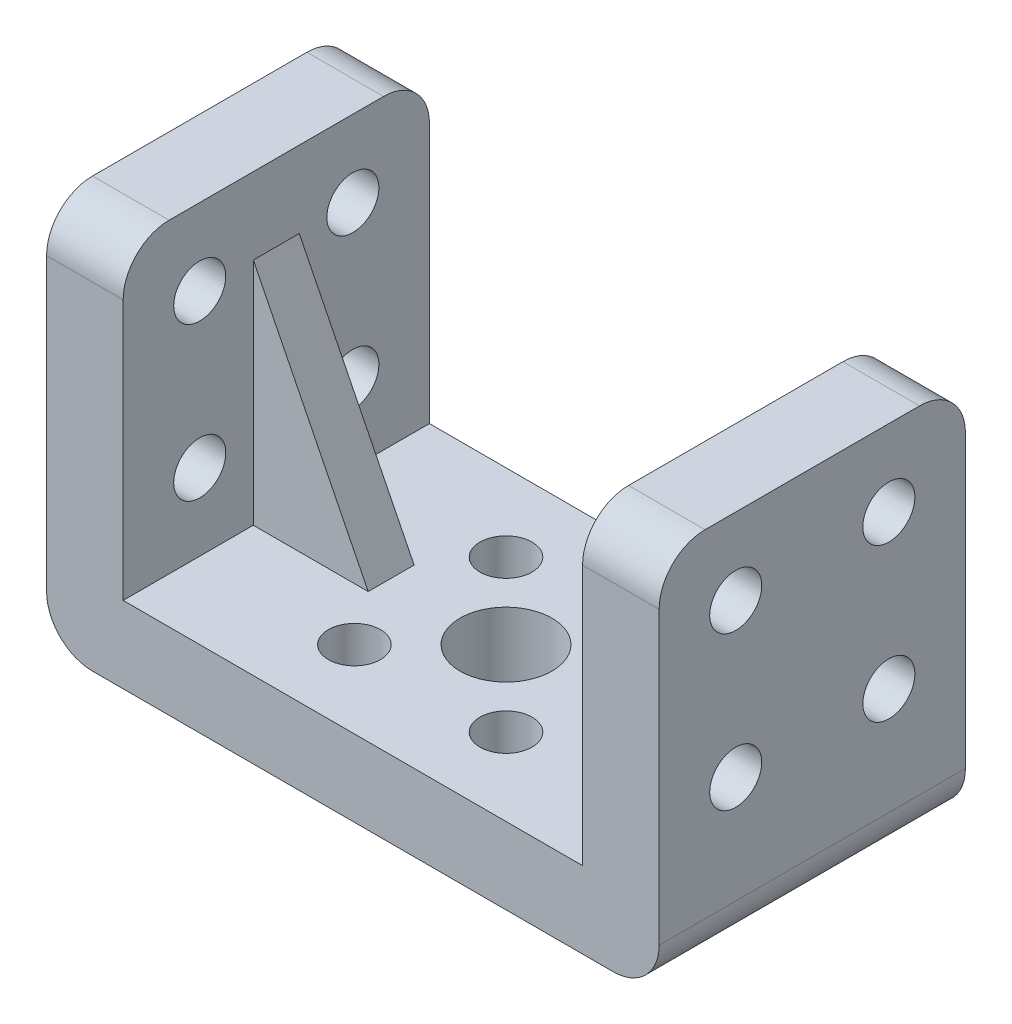
ISO-10303-21;
HEADER;
FILE_DESCRIPTION(('STEP AP214'),'2;1');
FILE_NAME('part.step','',(''),(''),'','','');
FILE_SCHEMA(('AUTOMOTIVE_DESIGN { 1 0 10303 214 1 1 1 1 }'));
ENDSEC;
DATA;
#1=APPLICATION_CONTEXT('core data for automotive mechanical design processes');
#2=APPLICATION_PROTOCOL_DEFINITION('international standard','automotive_design',2000,#1);
#3=PRODUCT_CONTEXT('',#1,'mechanical');
#4=PRODUCT('Part','Part','',(#3));
#5=PRODUCT_RELATED_PRODUCT_CATEGORY('part','',(#4));
#6=PRODUCT_DEFINITION_FORMATION('','',#4);
#7=PRODUCT_DEFINITION_CONTEXT('part definition',#1,'design');
#8=PRODUCT_DEFINITION('design','',#6,#7);
#9=PRODUCT_DEFINITION_SHAPE('','',#8);
#10=(LENGTH_UNIT() NAMED_UNIT(*) SI_UNIT(.MILLI.,.METRE.));
#11=(NAMED_UNIT(*) PLANE_ANGLE_UNIT() SI_UNIT($,.RADIAN.));
#12=(NAMED_UNIT(*) SI_UNIT($,.STERADIAN.) SOLID_ANGLE_UNIT());
#13=UNCERTAINTY_MEASURE_WITH_UNIT(LENGTH_MEASURE(1.E-05),#10,'distance_accuracy_value','');
#14=(GEOMETRIC_REPRESENTATION_CONTEXT(3) GLOBAL_UNCERTAINTY_ASSIGNED_CONTEXT((#13)) GLOBAL_UNIT_ASSIGNED_CONTEXT((#10,
#11,#12)) REPRESENTATION_CONTEXT('',''));
#15=CARTESIAN_POINT('',(0.,0.,0.));
#16=DIRECTION('',(0.,0.,1.));
#17=DIRECTION('',(1.,0.,0.));
#18=AXIS2_PLACEMENT_3D('',#15,#16,#17);
#19=CARTESIAN_POINT('',(0.,5.,0.));
#20=DIRECTION('',(0.,-1.,0.));
#21=DIRECTION('',(0.,0.,-1.));
#22=AXIS2_PLACEMENT_3D('',#19,#20,#21);
#23=PLANE('',#22);
#24=CARTESIAN_POINT('',(0.,5.,0.));
#25=DIRECTION('',(0.,1.,0.));
#26=DIRECTION('',(0.,0.,1.));
#27=AXIS2_PLACEMENT_3D('',#24,#25,#26);
#28=CIRCLE('',#27,3.);
#29=CARTESIAN_POINT('',(0.,5.,3.));
#30=VERTEX_POINT('',#29);
#31=EDGE_CURVE('E289',#30,#30,#28,.T.);
#32=ORIENTED_EDGE('',*,*,#31,.F.);
#33=EDGE_LOOP('',(#32));
#34=FACE_BOUND('',#33,.T.);
#35=CARTESIAN_POINT('',(-4.94974746830585,5.,-4.94974746830582));
#36=DIRECTION('',(0.,1.,0.));
#37=DIRECTION('',(0.,0.,1.));
#38=AXIS2_PLACEMENT_3D('',#35,#36,#37);
#39=CIRCLE('',#38,1.7);
#40=CARTESIAN_POINT('',(-4.94974746830585,5.,-3.24974746830582));
#41=VERTEX_POINT('',#40);
#42=EDGE_CURVE('E297',#41,#41,#39,.T.);
#43=ORIENTED_EDGE('',*,*,#42,.F.);
#44=EDGE_LOOP('',(#43));
#45=FACE_BOUND('',#44,.T.);
#46=CARTESIAN_POINT('',(-4.94974746830582,5.,4.94974746830584));
#47=DIRECTION('',(0.,1.,0.));
#48=DIRECTION('',(0.,0.,1.));
#49=AXIS2_PLACEMENT_3D('',#46,#47,#48);
#50=CIRCLE('',#49,1.7);
#51=CARTESIAN_POINT('',(-4.94974746830582,5.,6.64974746830584));
#52=VERTEX_POINT('',#51);
#53=EDGE_CURVE('E305',#52,#52,#50,.T.);
#54=ORIENTED_EDGE('',*,*,#53,.F.);
#55=EDGE_LOOP('',(#54));
#56=FACE_BOUND('',#55,.T.);
#57=CARTESIAN_POINT('',(4.94974746830584,5.,4.94974746830582));
#58=DIRECTION('',(0.,1.,0.));
#59=DIRECTION('',(0.,0.,1.));
#60=AXIS2_PLACEMENT_3D('',#57,#58,#59);
#61=CIRCLE('',#60,1.7);
#62=CARTESIAN_POINT('',(4.94974746830584,5.,6.64974746830582));
#63=VERTEX_POINT('',#62);
#64=EDGE_CURVE('E313',#63,#63,#61,.T.);
#65=ORIENTED_EDGE('',*,*,#64,.F.);
#66=EDGE_LOOP('',(#65));
#67=FACE_BOUND('',#66,.T.);
#68=CARTESIAN_POINT('',(4.94974746830582,5.,-4.94974746830585));
#69=DIRECTION('',(0.,1.,0.));
#70=DIRECTION('',(0.,0.,1.));
#71=AXIS2_PLACEMENT_3D('',#68,#69,#70);
#72=CIRCLE('',#71,1.7);
#73=CARTESIAN_POINT('',(4.94974746830582,5.,-3.24974746830585));
#74=VERTEX_POINT('',#73);
#75=EDGE_CURVE('E321',#74,#74,#72,.T.);
#76=ORIENTED_EDGE('',*,*,#75,.F.);
#77=EDGE_LOOP('',(#76));
#78=FACE_BOUND('',#77,.T.);
#79=DIRECTION('',(0.,0.,-1.));
#80=VECTOR('',#79,1.);
#81=CARTESIAN_POINT('',(-15.,5.,-10.));
#82=LINE('',#81,#80);
#83=CARTESIAN_POINT('',(-15.,5.,-1.5));
#84=VERTEX_POINT('',#83);
#85=CARTESIAN_POINT('',(-15.,5.,-10.));
#86=VERTEX_POINT('',#85);
#87=EDGE_CURVE('E194',#84,#86,#82,.T.);
#88=ORIENTED_EDGE('',*,*,#87,.F.);
#89=DIRECTION('',(1.,0.,0.));
#90=VECTOR('',#89,1.);
#91=CARTESIAN_POINT('',(-7.5,5.,-1.5));
#92=LINE('',#91,#90);
#93=CARTESIAN_POINT('',(-7.5,5.,-1.5));
#94=VERTEX_POINT('',#93);
#95=EDGE_CURVE('E210',#84,#94,#92,.T.);
#96=ORIENTED_EDGE('',*,*,#95,.T.);
#97=DIRECTION('',(0.,0.,1.));
#98=VECTOR('',#97,1.);
#99=CARTESIAN_POINT('',(-7.5,5.,-1.5));
#100=LINE('',#99,#98);
#101=CARTESIAN_POINT('',(-7.5,5.,1.5));
#102=VERTEX_POINT('',#101);
#103=EDGE_CURVE('E200',#94,#102,#100,.T.);
#104=ORIENTED_EDGE('',*,*,#103,.T.);
#105=DIRECTION('',(1.,0.,0.));
#106=VECTOR('',#105,1.);
#107=CARTESIAN_POINT('',(-7.5,5.,1.5));
#108=LINE('',#107,#106);
#109=CARTESIAN_POINT('',(-15.,5.,1.5));
#110=VERTEX_POINT('',#109);
#111=EDGE_CURVE('E197',#110,#102,#108,.T.);
#112=ORIENTED_EDGE('',*,*,#111,.F.);
#113=CARTESIAN_POINT('',(-15.,5.,10.));
#114=VERTEX_POINT('',#113);
#115=EDGE_CURVE('E181',#114,#110,#82,.T.);
#116=ORIENTED_EDGE('',*,*,#115,.F.);
#117=DIRECTION('',(1.,0.,0.));
#118=VECTOR('',#117,1.);
#119=CARTESIAN_POINT('',(-20.,5.,10.));
#120=LINE('',#119,#118);
#121=CARTESIAN_POINT('',(15.,5.,10.));
#122=VERTEX_POINT('',#121);
#123=EDGE_CURVE('E333',#114,#122,#120,.T.);
#124=ORIENTED_EDGE('',*,*,#123,.T.);
#125=DIRECTION('',(0.,0.,1.));
#126=VECTOR('',#125,1.);
#127=CARTESIAN_POINT('',(15.,5.,-10.));
#128=LINE('',#127,#126);
#129=CARTESIAN_POINT('',(15.,5.,1.5));
#130=VERTEX_POINT('',#129);
#131=EDGE_CURVE('E281',#130,#122,#128,.T.);
#132=ORIENTED_EDGE('',*,*,#131,.F.);
#133=DIRECTION('',(1.,0.,0.));
#134=VECTOR('',#133,1.);
#135=CARTESIAN_POINT('',(7.5,5.,1.5));
#136=LINE('',#135,#134);
#137=CARTESIAN_POINT('',(7.5,5.,1.5));
#138=VERTEX_POINT('',#137);
#139=EDGE_CURVE('E206',#138,#130,#136,.T.);
#140=ORIENTED_EDGE('',*,*,#139,.F.);
#141=DIRECTION('',(0.,0.,1.));
#142=VECTOR('',#141,1.);
#143=CARTESIAN_POINT('',(7.5,5.,-1.5));
#144=LINE('',#143,#142);
#145=CARTESIAN_POINT('',(7.5,5.,-1.5));
#146=VERTEX_POINT('',#145);
#147=EDGE_CURVE('E235',#146,#138,#144,.T.);
#148=ORIENTED_EDGE('',*,*,#147,.F.);
#149=DIRECTION('',(1.,0.,0.));
#150=VECTOR('',#149,1.);
#151=CARTESIAN_POINT('',(7.5,5.,-1.5));
#152=LINE('',#151,#150);
#153=CARTESIAN_POINT('',(15.,5.,-1.5));
#154=VERTEX_POINT('',#153);
#155=EDGE_CURVE('E246',#146,#154,#152,.T.);
#156=ORIENTED_EDGE('',*,*,#155,.T.);
#157=CARTESIAN_POINT('',(15.,5.,-10.));
#158=VERTEX_POINT('',#157);
#159=EDGE_CURVE('E277',#158,#154,#128,.T.);
#160=ORIENTED_EDGE('',*,*,#159,.F.);
#161=DIRECTION('',(-1.,0.,0.));
#162=VECTOR('',#161,1.);
#163=CARTESIAN_POINT('',(-20.,5.,-10.));
#164=LINE('',#163,#162);
#165=EDGE_CURVE('E329',#158,#86,#164,.T.);
#166=ORIENTED_EDGE('',*,*,#165,.T.);
#167=EDGE_LOOP('',(#88,#96,#104,#112,#116,#124,#132,#140,#148,#156,#160,#166));
#168=FACE_BOUND('',#167,.T.);
#169=ADVANCED_FACE('F45',(#34,#45,#56,#67,#78,#168),#23,.F.);
#170=CARTESIAN_POINT('',(15.,25.,-10.));
#171=DIRECTION('',(1.,0.,0.));
#172=DIRECTION('',(0.,0.,-1.));
#173=AXIS2_PLACEMENT_3D('',#170,#171,#172);
#174=PLANE('',#173);
#175=CARTESIAN_POINT('',(15.,10.,-5.));
#176=DIRECTION('',(1.,0.,0.));
#177=DIRECTION('',(0.,0.,-1.));
#178=AXIS2_PLACEMENT_3D('',#175,#176,#177);
#179=CIRCLE('',#178,1.7);
#180=CARTESIAN_POINT('',(15.,10.,-6.7));
#181=VERTEX_POINT('',#180);
#182=EDGE_CURVE('E238',#181,#181,#179,.T.);
#183=ORIENTED_EDGE('',*,*,#182,.T.);
#184=EDGE_LOOP('',(#183));
#185=FACE_BOUND('',#184,.T.);
#186=CARTESIAN_POINT('',(15.,10.,5.));
#187=DIRECTION('',(1.,0.,0.));
#188=DIRECTION('',(0.,0.,-1.));
#189=AXIS2_PLACEMENT_3D('',#186,#187,#188);
#190=CIRCLE('',#189,1.7);
#191=CARTESIAN_POINT('',(15.,10.,3.3));
#192=VERTEX_POINT('',#191);
#193=EDGE_CURVE('E375',#192,#192,#190,.T.);
#194=ORIENTED_EDGE('',*,*,#193,.T.);
#195=EDGE_LOOP('',(#194));
#196=FACE_BOUND('',#195,.T.);
#197=CARTESIAN_POINT('',(15.,20.,5.));
#198=DIRECTION('',(1.,0.,0.));
#199=DIRECTION('',(0.,0.,-1.));
#200=AXIS2_PLACEMENT_3D('',#197,#198,#199);
#201=CIRCLE('',#200,1.7);
#202=CARTESIAN_POINT('',(15.,20.,3.3));
#203=VERTEX_POINT('',#202);
#204=EDGE_CURVE('E370',#203,#203,#201,.T.);
#205=ORIENTED_EDGE('',*,*,#204,.T.);
#206=EDGE_LOOP('',(#205));
#207=FACE_BOUND('',#206,.T.);
#208=CARTESIAN_POINT('',(15.,20.,-5.));
#209=DIRECTION('',(1.,0.,0.));
#210=DIRECTION('',(0.,0.,-1.));
#211=AXIS2_PLACEMENT_3D('',#208,#209,#210);
#212=CIRCLE('',#211,1.7);
#213=CARTESIAN_POINT('',(15.,20.,-6.7));
#214=VERTEX_POINT('',#213);
#215=EDGE_CURVE('E364',#214,#214,#212,.T.);
#216=ORIENTED_EDGE('',*,*,#215,.T.);
#217=EDGE_LOOP('',(#216));
#218=FACE_BOUND('',#217,.T.);
#219=DIRECTION('',(0.,-1.,0.));
#220=VECTOR('',#219,1.);
#221=CARTESIAN_POINT('',(15.,25.,10.));
#222=LINE('',#221,#220);
#223=CARTESIAN_POINT('',(15.,22.,10.));
#224=VERTEX_POINT('',#223);
#225=EDGE_CURVE('E273',#224,#122,#222,.T.);
#226=ORIENTED_EDGE('',*,*,#225,.F.);
#227=CARTESIAN_POINT('',(15.,22.,7.));
#228=DIRECTION('',(1.,0.,0.));
#229=DIRECTION('',(0.,0.,-1.));
#230=AXIS2_PLACEMENT_3D('',#227,#228,#229);
#231=CIRCLE('',#230,3.);
#232=CARTESIAN_POINT('',(15.,25.,7.));
#233=VERTEX_POINT('',#232);
#234=EDGE_CURVE('E440',#224,#233,#231,.F.);
#235=ORIENTED_EDGE('',*,*,#234,.T.);
#236=DIRECTION('',(0.,0.,1.));
#237=VECTOR('',#236,1.);
#238=CARTESIAN_POINT('',(15.,25.,-10.));
#239=LINE('',#238,#237);
#240=CARTESIAN_POINT('',(15.,25.,-7.));
#241=VERTEX_POINT('',#240);
#242=EDGE_CURVE('E276',#241,#233,#239,.T.);
#243=ORIENTED_EDGE('',*,*,#242,.F.);
#244=CARTESIAN_POINT('',(15.,22.,-7.));
#245=DIRECTION('',(1.,0.,0.));
#246=DIRECTION('',(0.,0.,-1.));
#247=AXIS2_PLACEMENT_3D('',#244,#245,#246);
#248=CIRCLE('',#247,3.);
#249=CARTESIAN_POINT('',(15.,22.,-10.));
#250=VERTEX_POINT('',#249);
#251=EDGE_CURVE('E437',#241,#250,#248,.F.);
#252=ORIENTED_EDGE('',*,*,#251,.T.);
#253=DIRECTION('',(0.,-1.,0.));
#254=VECTOR('',#253,1.);
#255=CARTESIAN_POINT('',(15.,25.,-10.));
#256=LINE('',#255,#254);
#257=EDGE_CURVE('E227',#250,#158,#256,.T.);
#258=ORIENTED_EDGE('',*,*,#257,.T.);
#259=ORIENTED_EDGE('',*,*,#159,.T.);
#260=DIRECTION('',(0.,1.,0.));
#261=VECTOR('',#260,1.);
#262=CARTESIAN_POINT('',(15.,5.,-1.5));
#263=LINE('',#262,#261);
#264=CARTESIAN_POINT('',(15.,20.,-1.5));
#265=VERTEX_POINT('',#264);
#266=EDGE_CURVE('E242',#154,#265,#263,.T.);
#267=ORIENTED_EDGE('',*,*,#266,.T.);
#268=DIRECTION('',(0.,0.,1.));
#269=VECTOR('',#268,1.);
#270=CARTESIAN_POINT('',(15.,20.,-1.5));
#271=LINE('',#270,#269);
#272=CARTESIAN_POINT('',(15.,20.,1.5));
#273=VERTEX_POINT('',#272);
#274=EDGE_CURVE('E230',#265,#273,#271,.T.);
#275=ORIENTED_EDGE('',*,*,#274,.T.);
#276=DIRECTION('',(0.,1.,0.));
#277=VECTOR('',#276,1.);
#278=CARTESIAN_POINT('',(15.,5.,1.5));
#279=LINE('',#278,#277);
#280=EDGE_CURVE('E254',#130,#273,#279,.T.);
#281=ORIENTED_EDGE('',*,*,#280,.F.);
#282=ORIENTED_EDGE('',*,*,#131,.T.);
#283=EDGE_LOOP('',(#226,#235,#243,#252,#258,#259,#267,#275,#281,#282));
#284=FACE_BOUND('',#283,.T.);
#285=ADVANCED_FACE('F497',(#185,#196,#207,#218,#284),#174,.F.);
#286=CARTESIAN_POINT('',(0.,0.,0.));
#287=DIRECTION('',(0.,-1.,0.));
#288=DIRECTION('',(0.,0.,-1.));
#289=AXIS2_PLACEMENT_3D('',#286,#287,#288);
#290=PLANE('',#289);
#291=CARTESIAN_POINT('',(-4.94974746830585,0.,-4.94974746830582));
#292=DIRECTION('',(0.,1.,0.));
#293=DIRECTION('',(0.,0.,1.));
#294=AXIS2_PLACEMENT_3D('',#291,#292,#293);
#295=CIRCLE('',#294,1.7);
#296=CARTESIAN_POINT('',(-4.94974746830585,0.,-3.24974746830582));
#297=VERTEX_POINT('',#296);
#298=EDGE_CURVE('E293',#297,#297,#295,.T.);
#299=ORIENTED_EDGE('',*,*,#298,.T.);
#300=EDGE_LOOP('',(#299));
#301=FACE_BOUND('',#300,.T.);
#302=CARTESIAN_POINT('',(4.94974746830584,0.,4.94974746830582));
#303=DIRECTION('',(0.,1.,0.));
#304=DIRECTION('',(0.,0.,1.));
#305=AXIS2_PLACEMENT_3D('',#302,#303,#304);
#306=CIRCLE('',#305,1.7);
#307=CARTESIAN_POINT('',(4.94974746830584,0.,6.64974746830582));
#308=VERTEX_POINT('',#307);
#309=EDGE_CURVE('E309',#308,#308,#306,.T.);
#310=ORIENTED_EDGE('',*,*,#309,.T.);
#311=EDGE_LOOP('',(#310));
#312=FACE_BOUND('',#311,.T.);
#313=DIRECTION('',(1.,0.,0.));
#314=VECTOR('',#313,1.);
#315=CARTESIAN_POINT('',(-20.,0.,10.));
#316=LINE('',#315,#314);
#317=CARTESIAN_POINT('',(-17.,0.,10.));
#318=VERTEX_POINT('',#317);
#319=CARTESIAN_POINT('',(17.,0.,10.));
#320=VERTEX_POINT('',#319);
#321=EDGE_CURVE('E334',#318,#320,#316,.T.);
#322=ORIENTED_EDGE('',*,*,#321,.F.);
#323=DIRECTION('',(0.,0.,1.));
#324=VECTOR('',#323,1.);
#325=CARTESIAN_POINT('',(-17.,0.,-10.));
#326=LINE('',#325,#324);
#327=CARTESIAN_POINT('',(-17.,0.,-10.));
#328=VERTEX_POINT('',#327);
#329=EDGE_CURVE('E404',#318,#328,#326,.F.);
#330=ORIENTED_EDGE('',*,*,#329,.T.);
#331=DIRECTION('',(-1.,0.,0.));
#332=VECTOR('',#331,1.);
#333=CARTESIAN_POINT('',(-20.,0.,-10.));
#334=LINE('',#333,#332);
#335=CARTESIAN_POINT('',(17.,0.,-10.));
#336=VERTEX_POINT('',#335);
#337=EDGE_CURVE('E325',#336,#328,#334,.T.);
#338=ORIENTED_EDGE('',*,*,#337,.F.);
#339=DIRECTION('',(0.,0.,-1.));
#340=VECTOR('',#339,1.);
#341=CARTESIAN_POINT('',(17.,0.,10.));
#342=LINE('',#341,#340);
#343=EDGE_CURVE('E401',#336,#320,#342,.F.);
#344=ORIENTED_EDGE('',*,*,#343,.T.);
#345=EDGE_LOOP('',(#322,#330,#338,#344));
#346=FACE_BOUND('',#345,.T.);
#347=CARTESIAN_POINT('',(4.94974746830582,0.,-4.94974746830585));
#348=DIRECTION('',(0.,1.,0.));
#349=DIRECTION('',(0.,0.,1.));
#350=AXIS2_PLACEMENT_3D('',#347,#348,#349);
#351=CIRCLE('',#350,1.7);
#352=CARTESIAN_POINT('',(4.94974746830582,0.,-3.24974746830585));
#353=VERTEX_POINT('',#352);
#354=EDGE_CURVE('E317',#353,#353,#351,.T.);
#355=ORIENTED_EDGE('',*,*,#354,.T.);
#356=EDGE_LOOP('',(#355));
#357=FACE_BOUND('',#356,.T.);
#358=CARTESIAN_POINT('',(-4.94974746830582,0.,4.94974746830584));
#359=DIRECTION('',(0.,1.,0.));
#360=DIRECTION('',(0.,0.,1.));
#361=AXIS2_PLACEMENT_3D('',#358,#359,#360);
#362=CIRCLE('',#361,1.7);
#363=CARTESIAN_POINT('',(-4.94974746830582,0.,6.64974746830584));
#364=VERTEX_POINT('',#363);
#365=EDGE_CURVE('E301',#364,#364,#362,.T.);
#366=ORIENTED_EDGE('',*,*,#365,.T.);
#367=EDGE_LOOP('',(#366));
#368=FACE_BOUND('',#367,.T.);
#369=CARTESIAN_POINT('',(0.,0.,0.));
#370=DIRECTION('',(0.,1.,0.));
#371=DIRECTION('',(0.,0.,1.));
#372=AXIS2_PLACEMENT_3D('',#369,#370,#371);
#373=CIRCLE('',#372,3.);
#374=CARTESIAN_POINT('',(0.,0.,3.));
#375=VERTEX_POINT('',#374);
#376=EDGE_CURVE('E270',#375,#375,#373,.T.);
#377=ORIENTED_EDGE('',*,*,#376,.T.);
#378=EDGE_LOOP('',(#377));
#379=FACE_BOUND('',#378,.T.);
#380=ADVANCED_FACE('F475',(#301,#312,#346,#357,#368,#379),#290,.T.);
#381=CARTESIAN_POINT('',(20.,5.,10.));
#382=DIRECTION('',(-1.,0.,0.));
#383=DIRECTION('',(0.,0.,1.));
#384=AXIS2_PLACEMENT_3D('',#381,#382,#383);
#385=PLANE('',#384);
#386=CARTESIAN_POINT('',(20.,10.,-5.));
#387=DIRECTION('',(-1.,0.,0.));
#388=DIRECTION('',(0.,0.,1.));
#389=AXIS2_PLACEMENT_3D('',#386,#387,#388);
#390=CIRCLE('',#389,1.7);
#391=CARTESIAN_POINT('',(20.,10.,-3.3));
#392=VERTEX_POINT('',#391);
#393=EDGE_CURVE('E923',#392,#392,#390,.T.);
#394=ORIENTED_EDGE('',*,*,#393,.T.);
#395=EDGE_LOOP('',(#394));
#396=FACE_BOUND('',#395,.T.);
#397=CARTESIAN_POINT('',(20.,10.,5.));
#398=DIRECTION('',(-1.,0.,0.));
#399=DIRECTION('',(0.,0.,1.));
#400=AXIS2_PLACEMENT_3D('',#397,#398,#399);
#401=CIRCLE('',#400,1.7);
#402=CARTESIAN_POINT('',(20.,10.,6.7));
#403=VERTEX_POINT('',#402);
#404=EDGE_CURVE('E931',#403,#403,#401,.T.);
#405=ORIENTED_EDGE('',*,*,#404,.T.);
#406=EDGE_LOOP('',(#405));
#407=FACE_BOUND('',#406,.T.);
#408=CARTESIAN_POINT('',(20.,20.,5.));
#409=DIRECTION('',(-1.,0.,0.));
#410=DIRECTION('',(0.,0.,1.));
#411=AXIS2_PLACEMENT_3D('',#408,#409,#410);
#412=CIRCLE('',#411,1.7);
#413=CARTESIAN_POINT('',(20.,20.,6.7));
#414=VERTEX_POINT('',#413);
#415=EDGE_CURVE('E897',#414,#414,#412,.T.);
#416=ORIENTED_EDGE('',*,*,#415,.T.);
#417=EDGE_LOOP('',(#416));
#418=FACE_BOUND('',#417,.T.);
#419=CARTESIAN_POINT('',(20.,20.,-5.));
#420=DIRECTION('',(-1.,0.,0.));
#421=DIRECTION('',(0.,0.,1.));
#422=AXIS2_PLACEMENT_3D('',#419,#420,#421);
#423=CIRCLE('',#422,1.7);
#424=CARTESIAN_POINT('',(20.,20.,-3.3));
#425=VERTEX_POINT('',#424);
#426=EDGE_CURVE('E365',#425,#425,#423,.T.);
#427=ORIENTED_EDGE('',*,*,#426,.T.);
#428=EDGE_LOOP('',(#427));
#429=FACE_BOUND('',#428,.T.);
#430=DIRECTION('',(0.,-1.,0.));
#431=VECTOR('',#430,1.);
#432=CARTESIAN_POINT('',(20.,5.,10.));
#433=LINE('',#432,#431);
#434=CARTESIAN_POINT('',(20.,22.,10.));
#435=VERTEX_POINT('',#434);
#436=CARTESIAN_POINT('',(20.,3.,10.));
#437=VERTEX_POINT('',#436);
#438=EDGE_CURVE('E337',#435,#437,#433,.T.);
#439=ORIENTED_EDGE('',*,*,#438,.T.);
#440=DIRECTION('',(0.,0.,-1.));
#441=VECTOR('',#440,1.);
#442=CARTESIAN_POINT('',(20.,3.,-10.));
#443=LINE('',#442,#441);
#444=CARTESIAN_POINT('',(20.,3.,-10.));
#445=VERTEX_POINT('',#444);
#446=EDGE_CURVE('E425',#437,#445,#443,.T.);
#447=ORIENTED_EDGE('',*,*,#446,.T.);
#448=DIRECTION('',(0.,-1.,0.));
#449=VECTOR('',#448,1.);
#450=CARTESIAN_POINT('',(20.,5.,-10.));
#451=LINE('',#450,#449);
#452=CARTESIAN_POINT('',(20.,22.,-10.));
#453=VERTEX_POINT('',#452);
#454=EDGE_CURVE('E355',#453,#445,#451,.T.);
#455=ORIENTED_EDGE('',*,*,#454,.F.);
#456=CARTESIAN_POINT('',(20.,22.,-7.));
#457=DIRECTION('',(-1.,0.,0.));
#458=DIRECTION('',(0.,0.,1.));
#459=AXIS2_PLACEMENT_3D('',#456,#457,#458);
#460=CIRCLE('',#459,3.);
#461=CARTESIAN_POINT('',(20.,25.,-7.));
#462=VERTEX_POINT('',#461);
#463=EDGE_CURVE('E419',#453,#462,#460,.F.);
#464=ORIENTED_EDGE('',*,*,#463,.T.);
#465=DIRECTION('',(0.,0.,-1.));
#466=VECTOR('',#465,1.);
#467=CARTESIAN_POINT('',(20.,25.,-10.));
#468=LINE('',#467,#466);
#469=CARTESIAN_POINT('',(20.,25.,7.));
#470=VERTEX_POINT('',#469);
#471=EDGE_CURVE('E285',#470,#462,#468,.T.);
#472=ORIENTED_EDGE('',*,*,#471,.F.);
#473=CARTESIAN_POINT('',(20.,22.,7.));
#474=DIRECTION('',(-1.,0.,0.));
#475=DIRECTION('',(0.,0.,1.));
#476=AXIS2_PLACEMENT_3D('',#473,#474,#475);
#477=CIRCLE('',#476,3.);
#478=EDGE_CURVE('E422',#470,#435,#477,.F.);
#479=ORIENTED_EDGE('',*,*,#478,.T.);
#480=EDGE_LOOP('',(#439,#447,#455,#464,#472,#479));
#481=FACE_BOUND('',#480,.T.);
#482=ADVANCED_FACE('F484',(#396,#407,#418,#429,#481),#385,.F.);
#483=CARTESIAN_POINT('',(-20.,5.,-10.));
#484=DIRECTION('',(0.,0.,1.));
#485=DIRECTION('',(1.,0.,0.));
#486=AXIS2_PLACEMENT_3D('',#483,#484,#485);
#487=PLANE('',#486);
#488=ORIENTED_EDGE('',*,*,#337,.T.);
#489=CARTESIAN_POINT('',(-17.,3.,-10.));
#490=DIRECTION('',(0.,0.,1.));
#491=DIRECTION('',(1.,0.,0.));
#492=AXIS2_PLACEMENT_3D('',#489,#490,#491);
#493=CIRCLE('',#492,3.);
#494=CARTESIAN_POINT('',(-20.,3.,-10.));
#495=VERTEX_POINT('',#494);
#496=EDGE_CURVE('E416',#328,#495,#493,.F.);
#497=ORIENTED_EDGE('',*,*,#496,.T.);
#498=DIRECTION('',(0.,-1.,0.));
#499=VECTOR('',#498,1.);
#500=CARTESIAN_POINT('',(-20.,5.,-10.));
#501=LINE('',#500,#499);
#502=CARTESIAN_POINT('',(-20.,22.,-10.));
#503=VERTEX_POINT('',#502);
#504=EDGE_CURVE('E351',#503,#495,#501,.T.);
#505=ORIENTED_EDGE('',*,*,#504,.F.);
#506=DIRECTION('',(-1.,0.,0.));
#507=VECTOR('',#506,1.);
#508=CARTESIAN_POINT('',(-15.,22.,-10.));
#509=LINE('',#508,#507);
#510=CARTESIAN_POINT('',(-15.,22.,-10.));
#511=VERTEX_POINT('',#510);
#512=EDGE_CURVE('E407',#503,#511,#509,.F.);
#513=ORIENTED_EDGE('',*,*,#512,.T.);
#514=DIRECTION('',(0.,-1.,0.));
#515=VECTOR('',#514,1.);
#516=CARTESIAN_POINT('',(-15.,25.,-10.));
#517=LINE('',#516,#515);
#518=EDGE_CURVE('E264',#511,#86,#517,.T.);
#519=ORIENTED_EDGE('',*,*,#518,.T.);
#520=ORIENTED_EDGE('',*,*,#165,.F.);
#521=ORIENTED_EDGE('',*,*,#257,.F.);
#522=DIRECTION('',(-1.,0.,0.));
#523=VECTOR('',#522,1.);
#524=CARTESIAN_POINT('',(-20.,22.,-10.));
#525=LINE('',#524,#523);
#526=EDGE_CURVE('E410',#250,#453,#525,.F.);
#527=ORIENTED_EDGE('',*,*,#526,.T.);
#528=ORIENTED_EDGE('',*,*,#454,.T.);
#529=CARTESIAN_POINT('',(17.,3.,-10.));
#530=DIRECTION('',(0.,0.,1.));
#531=DIRECTION('',(1.,0.,0.));
#532=AXIS2_PLACEMENT_3D('',#529,#530,#531);
#533=CIRCLE('',#532,3.);
#534=EDGE_CURVE('E413',#445,#336,#533,.F.);
#535=ORIENTED_EDGE('',*,*,#534,.T.);
#536=EDGE_LOOP('',(#488,#497,#505,#513,#519,#520,#521,#527,#528,#535));
#537=FACE_BOUND('',#536,.T.);
#538=ADVANCED_FACE('F466',(#537),#487,.F.);
#539=CARTESIAN_POINT('',(-20.,5.,10.));
#540=DIRECTION('',(1.,0.,0.));
#541=DIRECTION('',(0.,0.,-1.));
#542=AXIS2_PLACEMENT_3D('',#539,#540,#541);
#543=PLANE('',#542);
#544=CARTESIAN_POINT('',(-20.,10.,-5.));
#545=DIRECTION('',(-1.,0.,0.));
#546=DIRECTION('',(0.,0.,1.));
#547=AXIS2_PLACEMENT_3D('',#544,#545,#546);
#548=CIRCLE('',#547,1.7);
#549=CARTESIAN_POINT('',(-20.,10.,-3.3));
#550=VERTEX_POINT('',#549);
#551=EDGE_CURVE('E927',#550,#550,#548,.T.);
#552=ORIENTED_EDGE('',*,*,#551,.F.);
#553=EDGE_LOOP('',(#552));
#554=FACE_BOUND('',#553,.T.);
#555=CARTESIAN_POINT('',(-20.,10.,5.));
#556=DIRECTION('',(-1.,0.,0.));
#557=DIRECTION('',(0.,0.,1.));
#558=AXIS2_PLACEMENT_3D('',#555,#556,#557);
#559=CIRCLE('',#558,1.7);
#560=CARTESIAN_POINT('',(-20.,10.,6.7));
#561=VERTEX_POINT('',#560);
#562=EDGE_CURVE('E935',#561,#561,#559,.T.);
#563=ORIENTED_EDGE('',*,*,#562,.F.);
#564=EDGE_LOOP('',(#563));
#565=FACE_BOUND('',#564,.T.);
#566=CARTESIAN_POINT('',(-20.,20.,5.));
#567=DIRECTION('',(-1.,0.,0.));
#568=DIRECTION('',(0.,0.,1.));
#569=AXIS2_PLACEMENT_3D('',#566,#567,#568);
#570=CIRCLE('',#569,1.7);
#571=CARTESIAN_POINT('',(-20.,20.,6.7));
#572=VERTEX_POINT('',#571);
#573=EDGE_CURVE('E890',#572,#572,#570,.T.);
#574=ORIENTED_EDGE('',*,*,#573,.F.);
#575=EDGE_LOOP('',(#574));
#576=FACE_BOUND('',#575,.T.);
#577=CARTESIAN_POINT('',(-20.,20.,-5.));
#578=DIRECTION('',(-1.,0.,0.));
#579=DIRECTION('',(0.,0.,1.));
#580=AXIS2_PLACEMENT_3D('',#577,#578,#579);
#581=CIRCLE('',#580,1.7);
#582=CARTESIAN_POINT('',(-20.,20.,-3.3));
#583=VERTEX_POINT('',#582);
#584=EDGE_CURVE('E887',#583,#583,#581,.T.);
#585=ORIENTED_EDGE('',*,*,#584,.F.);
#586=EDGE_LOOP('',(#585));
#587=FACE_BOUND('',#586,.T.);
#588=ORIENTED_EDGE('',*,*,#504,.T.);
#589=DIRECTION('',(0.,0.,1.));
#590=VECTOR('',#589,1.);
#591=CARTESIAN_POINT('',(-20.,3.,10.));
#592=LINE('',#591,#590);
#593=CARTESIAN_POINT('',(-20.,3.,10.));
#594=VERTEX_POINT('',#593);
#595=EDGE_CURVE('E385',#495,#594,#592,.T.);
#596=ORIENTED_EDGE('',*,*,#595,.T.);
#597=DIRECTION('',(0.,-1.,0.));
#598=VECTOR('',#597,1.);
#599=CARTESIAN_POINT('',(-20.,5.,10.));
#600=LINE('',#599,#598);
#601=CARTESIAN_POINT('',(-20.,22.,10.));
#602=VERTEX_POINT('',#601);
#603=EDGE_CURVE('E347',#602,#594,#600,.T.);
#604=ORIENTED_EDGE('',*,*,#603,.F.);
#605=CARTESIAN_POINT('',(-20.,22.,7.));
#606=DIRECTION('',(1.,0.,0.));
#607=DIRECTION('',(0.,0.,-1.));
#608=AXIS2_PLACEMENT_3D('',#605,#606,#607);
#609=CIRCLE('',#608,3.);
#610=CARTESIAN_POINT('',(-20.,25.,7.));
#611=VERTEX_POINT('',#610);
#612=EDGE_CURVE('E359',#602,#611,#609,.F.);
#613=ORIENTED_EDGE('',*,*,#612,.T.);
#614=DIRECTION('',(0.,0.,1.));
#615=VECTOR('',#614,1.);
#616=CARTESIAN_POINT('',(-20.,25.,-10.));
#617=LINE('',#616,#615);
#618=CARTESIAN_POINT('',(-20.,25.,-7.));
#619=VERTEX_POINT('',#618);
#620=EDGE_CURVE('E193',#619,#611,#617,.T.);
#621=ORIENTED_EDGE('',*,*,#620,.F.);
#622=CARTESIAN_POINT('',(-20.,22.,-7.));
#623=DIRECTION('',(1.,0.,0.));
#624=DIRECTION('',(0.,0.,-1.));
#625=AXIS2_PLACEMENT_3D('',#622,#623,#624);
#626=CIRCLE('',#625,3.);
#627=EDGE_CURVE('E382',#619,#503,#626,.F.);
#628=ORIENTED_EDGE('',*,*,#627,.T.);
#629=EDGE_LOOP('',(#588,#596,#604,#613,#621,#628));
#630=FACE_BOUND('',#629,.T.);
#631=ADVANCED_FACE('F456',(#554,#565,#576,#587,#630),#543,.F.);
#632=CARTESIAN_POINT('',(-20.,5.,10.));
#633=DIRECTION('',(0.,0.,-1.));
#634=DIRECTION('',(-1.,0.,0.));
#635=AXIS2_PLACEMENT_3D('',#632,#633,#634);
#636=PLANE('',#635);
#637=ORIENTED_EDGE('',*,*,#603,.T.);
#638=CARTESIAN_POINT('',(-17.,3.,10.));
#639=DIRECTION('',(0.,0.,-1.));
#640=DIRECTION('',(-1.,0.,0.));
#641=AXIS2_PLACEMENT_3D('',#638,#639,#640);
#642=CIRCLE('',#641,3.);
#643=EDGE_CURVE('E398',#594,#318,#642,.F.);
#644=ORIENTED_EDGE('',*,*,#643,.T.);
#645=ORIENTED_EDGE('',*,*,#321,.T.);
#646=CARTESIAN_POINT('',(17.,3.,10.));
#647=DIRECTION('',(0.,0.,-1.));
#648=DIRECTION('',(-1.,0.,0.));
#649=AXIS2_PLACEMENT_3D('',#646,#647,#648);
#650=CIRCLE('',#649,3.);
#651=EDGE_CURVE('E395',#320,#437,#650,.F.);
#652=ORIENTED_EDGE('',*,*,#651,.T.);
#653=ORIENTED_EDGE('',*,*,#438,.F.);
#654=DIRECTION('',(1.,0.,0.));
#655=VECTOR('',#654,1.);
#656=CARTESIAN_POINT('',(-20.,22.,10.));
#657=LINE('',#656,#655);
#658=EDGE_CURVE('E392',#435,#224,#657,.F.);
#659=ORIENTED_EDGE('',*,*,#658,.T.);
#660=ORIENTED_EDGE('',*,*,#225,.T.);
#661=ORIENTED_EDGE('',*,*,#123,.F.);
#662=DIRECTION('',(0.,-1.,0.));
#663=VECTOR('',#662,1.);
#664=CARTESIAN_POINT('',(-15.,25.,10.));
#665=LINE('',#664,#663);
#666=CARTESIAN_POINT('',(-15.,22.,10.));
#667=VERTEX_POINT('',#666);
#668=EDGE_CURVE('E188',#667,#114,#665,.T.);
#669=ORIENTED_EDGE('',*,*,#668,.F.);
#670=DIRECTION('',(1.,0.,0.));
#671=VECTOR('',#670,1.);
#672=CARTESIAN_POINT('',(-20.,22.,10.));
#673=LINE('',#672,#671);
#674=EDGE_CURVE('E389',#667,#602,#673,.F.);
#675=ORIENTED_EDGE('',*,*,#674,.T.);
#676=EDGE_LOOP('',(#637,#644,#645,#652,#653,#659,#660,#661,#669,#675));
#677=FACE_BOUND('',#676,.T.);
#678=ADVANCED_FACE('F451',(#677),#636,.F.);
#679=CARTESIAN_POINT('',(4.94974746830582,5.,-4.94974746830585));
#680=DIRECTION('',(0.,-1.,0.));
#681=DIRECTION('',(0.,0.,-1.));
#682=AXIS2_PLACEMENT_3D('',#679,#680,#681);
#683=CYLINDRICAL_SURFACE('',#682,1.7);
#684=ORIENTED_EDGE('',*,*,#75,.T.);
#685=EDGE_LOOP('',(#684));
#686=FACE_BOUND('',#685,.T.);
#687=ORIENTED_EDGE('',*,*,#354,.F.);
#688=EDGE_LOOP('',(#687));
#689=FACE_BOUND('',#688,.T.);
#690=ADVANCED_FACE('F535',(#686,#689),#683,.F.);
#691=CARTESIAN_POINT('',(4.94974746830584,5.,4.94974746830582));
#692=DIRECTION('',(0.,-1.,0.));
#693=DIRECTION('',(0.,0.,-1.));
#694=AXIS2_PLACEMENT_3D('',#691,#692,#693);
#695=CYLINDRICAL_SURFACE('',#694,1.7);
#696=ORIENTED_EDGE('',*,*,#64,.T.);
#697=EDGE_LOOP('',(#696));
#698=FACE_BOUND('',#697,.T.);
#699=ORIENTED_EDGE('',*,*,#309,.F.);
#700=EDGE_LOOP('',(#699));
#701=FACE_BOUND('',#700,.T.);
#702=ADVANCED_FACE('F764',(#698,#701),#695,.F.);
#703=CARTESIAN_POINT('',(-4.94974746830582,5.,4.94974746830584));
#704=DIRECTION('',(0.,-1.,0.));
#705=DIRECTION('',(0.,0.,-1.));
#706=AXIS2_PLACEMENT_3D('',#703,#704,#705);
#707=CYLINDRICAL_SURFACE('',#706,1.7);
#708=ORIENTED_EDGE('',*,*,#53,.T.);
#709=EDGE_LOOP('',(#708));
#710=FACE_BOUND('',#709,.T.);
#711=ORIENTED_EDGE('',*,*,#365,.F.);
#712=EDGE_LOOP('',(#711));
#713=FACE_BOUND('',#712,.T.);
#714=ADVANCED_FACE('F755',(#710,#713),#707,.F.);
#715=CARTESIAN_POINT('',(-4.94974746830585,5.,-4.94974746830582));
#716=DIRECTION('',(0.,-1.,0.));
#717=DIRECTION('',(0.,0.,-1.));
#718=AXIS2_PLACEMENT_3D('',#715,#716,#717);
#719=CYLINDRICAL_SURFACE('',#718,1.7);
#720=ORIENTED_EDGE('',*,*,#42,.T.);
#721=EDGE_LOOP('',(#720));
#722=FACE_BOUND('',#721,.T.);
#723=ORIENTED_EDGE('',*,*,#298,.F.);
#724=EDGE_LOOP('',(#723));
#725=FACE_BOUND('',#724,.T.);
#726=ADVANCED_FACE('F745',(#722,#725),#719,.F.);
#727=CARTESIAN_POINT('',(0.,5.,0.));
#728=DIRECTION('',(0.,-1.,0.));
#729=DIRECTION('',(0.,0.,-1.));
#730=AXIS2_PLACEMENT_3D('',#727,#728,#729);
#731=CYLINDRICAL_SURFACE('',#730,3.);
#732=ORIENTED_EDGE('',*,*,#31,.T.);
#733=EDGE_LOOP('',(#732));
#734=FACE_BOUND('',#733,.T.);
#735=ORIENTED_EDGE('',*,*,#376,.F.);
#736=EDGE_LOOP('',(#735));
#737=FACE_BOUND('',#736,.T.);
#738=ADVANCED_FACE('F737',(#734,#737),#731,.F.);
#739=CARTESIAN_POINT('',(0.,25.,0.));
#740=DIRECTION('',(0.,-1.,0.));
#741=DIRECTION('',(0.,0.,-1.));
#742=AXIS2_PLACEMENT_3D('',#739,#740,#741);
#743=PLANE('',#742);
#744=ORIENTED_EDGE('',*,*,#242,.T.);
#745=DIRECTION('',(1.,0.,0.));
#746=VECTOR('',#745,1.);
#747=CARTESIAN_POINT('',(0.,25.,7.));
#748=LINE('',#747,#746);
#749=EDGE_CURVE('E433',#233,#470,#748,.T.);
#750=ORIENTED_EDGE('',*,*,#749,.T.);
#751=ORIENTED_EDGE('',*,*,#471,.T.);
#752=DIRECTION('',(-1.,0.,0.));
#753=VECTOR('',#752,1.);
#754=CARTESIAN_POINT('',(0.,25.,-7.));
#755=LINE('',#754,#753);
#756=EDGE_CURVE('E429',#462,#241,#755,.T.);
#757=ORIENTED_EDGE('',*,*,#756,.T.);
#758=EDGE_LOOP('',(#744,#750,#751,#757));
#759=FACE_BOUND('',#758,.T.);
#760=ADVANCED_FACE('F492',(#759),#743,.F.);
#761=CARTESIAN_POINT('',(-15.,25.,-10.));
#762=DIRECTION('',(-1.,0.,0.));
#763=DIRECTION('',(0.,0.,1.));
#764=AXIS2_PLACEMENT_3D('',#761,#762,#763);
#765=PLANE('',#764);
#766=CARTESIAN_POINT('',(-15.,10.,-5.));
#767=DIRECTION('',(-1.,0.,0.));
#768=DIRECTION('',(0.,0.,1.));
#769=AXIS2_PLACEMENT_3D('',#766,#767,#768);
#770=CIRCLE('',#769,1.7);
#771=CARTESIAN_POINT('',(-15.,10.,-3.3));
#772=VERTEX_POINT('',#771);
#773=EDGE_CURVE('E376',#772,#772,#770,.T.);
#774=ORIENTED_EDGE('',*,*,#773,.T.);
#775=EDGE_LOOP('',(#774));
#776=FACE_BOUND('',#775,.T.);
#777=CARTESIAN_POINT('',(-15.,10.,5.));
#778=DIRECTION('',(-1.,0.,0.));
#779=DIRECTION('',(0.,0.,1.));
#780=AXIS2_PLACEMENT_3D('',#777,#778,#779);
#781=CIRCLE('',#780,1.7);
#782=CARTESIAN_POINT('',(-15.,10.,6.7));
#783=VERTEX_POINT('',#782);
#784=EDGE_CURVE('E371',#783,#783,#781,.T.);
#785=ORIENTED_EDGE('',*,*,#784,.T.);
#786=EDGE_LOOP('',(#785));
#787=FACE_BOUND('',#786,.T.);
#788=CARTESIAN_POINT('',(-15.,20.,5.));
#789=DIRECTION('',(-1.,0.,0.));
#790=DIRECTION('',(0.,0.,1.));
#791=AXIS2_PLACEMENT_3D('',#788,#789,#790);
#792=CIRCLE('',#791,1.7);
#793=CARTESIAN_POINT('',(-15.,20.,6.7));
#794=VERTEX_POINT('',#793);
#795=EDGE_CURVE('E366',#794,#794,#792,.T.);
#796=ORIENTED_EDGE('',*,*,#795,.T.);
#797=EDGE_LOOP('',(#796));
#798=FACE_BOUND('',#797,.T.);
#799=CARTESIAN_POINT('',(-15.,20.,-5.));
#800=DIRECTION('',(-1.,0.,0.));
#801=DIRECTION('',(0.,0.,1.));
#802=AXIS2_PLACEMENT_3D('',#799,#800,#801);
#803=CIRCLE('',#802,1.7);
#804=CARTESIAN_POINT('',(-15.,20.,-3.3));
#805=VERTEX_POINT('',#804);
#806=EDGE_CURVE('E360',#805,#805,#803,.T.);
#807=ORIENTED_EDGE('',*,*,#806,.T.);
#808=EDGE_LOOP('',(#807));
#809=FACE_BOUND('',#808,.T.);
#810=ORIENTED_EDGE('',*,*,#518,.F.);
#811=CARTESIAN_POINT('',(-15.,22.,-7.));
#812=DIRECTION('',(-1.,0.,0.));
#813=DIRECTION('',(0.,0.,1.));
#814=AXIS2_PLACEMENT_3D('',#811,#812,#813);
#815=CIRCLE('',#814,3.);
#816=CARTESIAN_POINT('',(-15.,25.,-7.));
#817=VERTEX_POINT('',#816);
#818=EDGE_CURVE('E11',#511,#817,#815,.F.);
#819=ORIENTED_EDGE('',*,*,#818,.T.);
#820=DIRECTION('',(0.,0.,-1.));
#821=VECTOR('',#820,1.);
#822=CARTESIAN_POINT('',(-15.,25.,-10.));
#823=LINE('',#822,#821);
#824=CARTESIAN_POINT('',(-15.,25.,7.));
#825=VERTEX_POINT('',#824);
#826=EDGE_CURVE('E262',#825,#817,#823,.T.);
#827=ORIENTED_EDGE('',*,*,#826,.F.);
#828=CARTESIAN_POINT('',(-15.,22.,7.));
#829=DIRECTION('',(-1.,0.,0.));
#830=DIRECTION('',(0.,0.,1.));
#831=AXIS2_PLACEMENT_3D('',#828,#829,#830);
#832=CIRCLE('',#831,3.);
#833=EDGE_CURVE('E54',#825,#667,#832,.F.);
#834=ORIENTED_EDGE('',*,*,#833,.T.);
#835=ORIENTED_EDGE('',*,*,#668,.T.);
#836=ORIENTED_EDGE('',*,*,#115,.T.);
#837=DIRECTION('',(0.,-1.,0.));
#838=VECTOR('',#837,1.);
#839=CARTESIAN_POINT('',(-15.,5.,1.5));
#840=LINE('',#839,#838);
#841=CARTESIAN_POINT('',(-15.,20.,1.5));
#842=VERTEX_POINT('',#841);
#843=EDGE_CURVE('E185',#842,#110,#840,.T.);
#844=ORIENTED_EDGE('',*,*,#843,.F.);
#845=DIRECTION('',(0.,0.,1.));
#846=VECTOR('',#845,1.);
#847=CARTESIAN_POINT('',(-15.,20.,-1.5));
#848=LINE('',#847,#846);
#849=CARTESIAN_POINT('',(-15.,20.,-1.5));
#850=VERTEX_POINT('',#849);
#851=EDGE_CURVE('E224',#850,#842,#848,.T.);
#852=ORIENTED_EDGE('',*,*,#851,.F.);
#853=DIRECTION('',(0.,-1.,0.));
#854=VECTOR('',#853,1.);
#855=CARTESIAN_POINT('',(-15.,5.,-1.5));
#856=LINE('',#855,#854);
#857=EDGE_CURVE('E221',#850,#84,#856,.T.);
#858=ORIENTED_EDGE('',*,*,#857,.T.);
#859=ORIENTED_EDGE('',*,*,#87,.T.);
#860=EDGE_LOOP('',(#810,#819,#827,#834,#835,#836,#844,#852,#858,#859));
#861=FACE_BOUND('',#860,.T.);
#862=ADVANCED_FACE('F183',(#776,#787,#798,#809,#861),#765,.F.);
#863=CARTESIAN_POINT('',(0.,25.,0.));
#864=DIRECTION('',(0.,1.,0.));
#865=DIRECTION('',(0.,0.,1.));
#866=AXIS2_PLACEMENT_3D('',#863,#864,#865);
#867=PLANE('',#866);
#868=ORIENTED_EDGE('',*,*,#826,.T.);
#869=DIRECTION('',(-1.,0.,0.));
#870=VECTOR('',#869,1.);
#871=CARTESIAN_POINT('',(-20.,25.,-7.));
#872=LINE('',#871,#870);
#873=EDGE_CURVE('E446',#817,#619,#872,.T.);
#874=ORIENTED_EDGE('',*,*,#873,.T.);
#875=ORIENTED_EDGE('',*,*,#620,.T.);
#876=DIRECTION('',(1.,0.,0.));
#877=VECTOR('',#876,1.);
#878=CARTESIAN_POINT('',(-15.,25.,7.));
#879=LINE('',#878,#877);
#880=EDGE_CURVE('E443',#611,#825,#879,.T.);
#881=ORIENTED_EDGE('',*,*,#880,.T.);
#882=EDGE_LOOP('',(#868,#874,#875,#881));
#883=FACE_BOUND('',#882,.T.);
#884=ADVANCED_FACE('F458',(#883),#867,.T.);
#885=CARTESIAN_POINT('',(-15.,20.,-1.5));
#886=DIRECTION('',(0.894427190999916,0.447213595499958,0.));
#887=DIRECTION('',(-0.447213595499958,0.894427190999916,0.));
#888=AXIS2_PLACEMENT_3D('',#885,#886,#887);
#889=PLANE('',#888);
#890=ORIENTED_EDGE('',*,*,#851,.T.);
#891=DIRECTION('',(-0.447213595499958,0.894427190999916,0.));
#892=VECTOR('',#891,1.);
#893=CARTESIAN_POINT('',(-15.,20.,1.5));
#894=LINE('',#893,#892);
#895=EDGE_CURVE('E205',#102,#842,#894,.T.);
#896=ORIENTED_EDGE('',*,*,#895,.F.);
#897=ORIENTED_EDGE('',*,*,#103,.F.);
#898=DIRECTION('',(-0.447213595499958,0.894427190999916,0.));
#899=VECTOR('',#898,1.);
#900=CARTESIAN_POINT('',(-15.,20.,-1.5));
#901=LINE('',#900,#899);
#902=EDGE_CURVE('E214',#94,#850,#901,.T.);
#903=ORIENTED_EDGE('',*,*,#902,.T.);
#904=EDGE_LOOP('',(#890,#896,#897,#903));
#905=FACE_BOUND('',#904,.T.);
#906=ADVANCED_FACE('F697',(#905),#889,.T.);
#907=CARTESIAN_POINT('',(0.,0.,-1.5));
#908=DIRECTION('',(0.,0.,-1.));
#909=DIRECTION('',(-1.,0.,0.));
#910=AXIS2_PLACEMENT_3D('',#907,#908,#909);
#911=PLANE('',#910);
#912=ORIENTED_EDGE('',*,*,#95,.F.);
#913=ORIENTED_EDGE('',*,*,#857,.F.);
#914=ORIENTED_EDGE('',*,*,#902,.F.);
#915=EDGE_LOOP('',(#912,#913,#914));
#916=FACE_BOUND('',#915,.T.);
#917=ADVANCED_FACE('F689',(#916),#911,.T.);
#918=CARTESIAN_POINT('',(0.,0.,1.5));
#919=DIRECTION('',(0.,0.,-1.));
#920=DIRECTION('',(-1.,0.,0.));
#921=AXIS2_PLACEMENT_3D('',#918,#919,#920);
#922=PLANE('',#921);
#923=ORIENTED_EDGE('',*,*,#111,.T.);
#924=ORIENTED_EDGE('',*,*,#895,.T.);
#925=ORIENTED_EDGE('',*,*,#843,.T.);
#926=EDGE_LOOP('',(#923,#924,#925));
#927=FACE_BOUND('',#926,.T.);
#928=ADVANCED_FACE('F208',(#927),#922,.F.);
#929=CARTESIAN_POINT('',(15.,20.,-1.5));
#930=DIRECTION('',(-0.894427190999916,0.447213595499958,0.));
#931=DIRECTION('',(-0.447213595499958,-0.894427190999916,0.));
#932=AXIS2_PLACEMENT_3D('',#929,#930,#931);
#933=PLANE('',#932);
#934=ORIENTED_EDGE('',*,*,#147,.T.);
#935=DIRECTION('',(-0.447213595499958,-0.894427190999916,0.));
#936=VECTOR('',#935,1.);
#937=CARTESIAN_POINT('',(15.,20.,1.5));
#938=LINE('',#937,#936);
#939=EDGE_CURVE('E250',#273,#138,#938,.T.);
#940=ORIENTED_EDGE('',*,*,#939,.F.);
#941=ORIENTED_EDGE('',*,*,#274,.F.);
#942=DIRECTION('',(-0.447213595499958,-0.894427190999916,0.));
#943=VECTOR('',#942,1.);
#944=CARTESIAN_POINT('',(15.,20.,-1.5));
#945=LINE('',#944,#943);
#946=EDGE_CURVE('E234',#265,#146,#945,.T.);
#947=ORIENTED_EDGE('',*,*,#946,.T.);
#948=EDGE_LOOP('',(#934,#940,#941,#947));
#949=FACE_BOUND('',#948,.T.);
#950=ADVANCED_FACE('F672',(#949),#933,.T.);
#951=CARTESIAN_POINT('',(0.,0.,-1.5));
#952=DIRECTION('',(0.,0.,1.));
#953=DIRECTION('',(1.,0.,0.));
#954=AXIS2_PLACEMENT_3D('',#951,#952,#953);
#955=PLANE('',#954);
#956=ORIENTED_EDGE('',*,*,#155,.F.);
#957=ORIENTED_EDGE('',*,*,#946,.F.);
#958=ORIENTED_EDGE('',*,*,#266,.F.);
#959=EDGE_LOOP('',(#956,#957,#958));
#960=FACE_BOUND('',#959,.T.);
#961=ADVANCED_FACE('F663',(#960),#955,.F.);
#962=CARTESIAN_POINT('',(0.,0.,1.5));
#963=DIRECTION('',(0.,0.,1.));
#964=DIRECTION('',(1.,0.,0.));
#965=AXIS2_PLACEMENT_3D('',#962,#963,#964);
#966=PLANE('',#965);
#967=ORIENTED_EDGE('',*,*,#139,.T.);
#968=ORIENTED_EDGE('',*,*,#280,.T.);
#969=ORIENTED_EDGE('',*,*,#939,.T.);
#970=EDGE_LOOP('',(#967,#968,#969));
#971=FACE_BOUND('',#970,.T.);
#972=ADVANCED_FACE('F655',(#971),#966,.T.);
#973=CARTESIAN_POINT('',(20.,20.,-5.));
#974=DIRECTION('',(-1.,0.,0.));
#975=DIRECTION('',(0.,0.,1.));
#976=AXIS2_PLACEMENT_3D('',#973,#974,#975);
#977=CYLINDRICAL_SURFACE('',#976,1.7);
#978=ORIENTED_EDGE('',*,*,#584,.T.);
#979=EDGE_LOOP('',(#978));
#980=FACE_BOUND('',#979,.T.);
#981=ORIENTED_EDGE('',*,*,#806,.F.);
#982=EDGE_LOOP('',(#981));
#983=FACE_BOUND('',#982,.T.);
#984=ADVANCED_FACE('F627',(#980,#983),#977,.F.);
#985=CARTESIAN_POINT('',(20.,20.,5.));
#986=DIRECTION('',(-1.,0.,0.));
#987=DIRECTION('',(0.,0.,1.));
#988=AXIS2_PLACEMENT_3D('',#985,#986,#987);
#989=CYLINDRICAL_SURFACE('',#988,1.7);
#990=ORIENTED_EDGE('',*,*,#573,.T.);
#991=EDGE_LOOP('',(#990));
#992=FACE_BOUND('',#991,.T.);
#993=ORIENTED_EDGE('',*,*,#795,.F.);
#994=EDGE_LOOP('',(#993));
#995=FACE_BOUND('',#994,.T.);
#996=ADVANCED_FACE('F618',(#992,#995),#989,.F.);
#997=CARTESIAN_POINT('',(20.,10.,5.));
#998=DIRECTION('',(-1.,0.,0.));
#999=DIRECTION('',(0.,0.,1.));
#1000=AXIS2_PLACEMENT_3D('',#997,#998,#999);
#1001=CYLINDRICAL_SURFACE('',#1000,1.7);
#1002=ORIENTED_EDGE('',*,*,#562,.T.);
#1003=EDGE_LOOP('',(#1002));
#1004=FACE_BOUND('',#1003,.T.);
#1005=ORIENTED_EDGE('',*,*,#784,.F.);
#1006=EDGE_LOOP('',(#1005));
#1007=FACE_BOUND('',#1006,.T.);
#1008=ADVANCED_FACE('F608',(#1004,#1007),#1001,.F.);
#1009=CARTESIAN_POINT('',(20.,10.,-5.));
#1010=DIRECTION('',(-1.,0.,0.));
#1011=DIRECTION('',(0.,0.,1.));
#1012=AXIS2_PLACEMENT_3D('',#1009,#1010,#1011);
#1013=CYLINDRICAL_SURFACE('',#1012,1.7);
#1014=ORIENTED_EDGE('',*,*,#551,.T.);
#1015=EDGE_LOOP('',(#1014));
#1016=FACE_BOUND('',#1015,.T.);
#1017=ORIENTED_EDGE('',*,*,#773,.F.);
#1018=EDGE_LOOP('',(#1017));
#1019=FACE_BOUND('',#1018,.T.);
#1020=ADVANCED_FACE('F598',(#1016,#1019),#1013,.F.);
#1021=ORIENTED_EDGE('',*,*,#426,.F.);
#1022=EDGE_LOOP('',(#1021));
#1023=FACE_BOUND('',#1022,.T.);
#1024=ORIENTED_EDGE('',*,*,#215,.F.);
#1025=EDGE_LOOP('',(#1024));
#1026=FACE_BOUND('',#1025,.T.);
#1027=ADVANCED_FACE('F615',(#1023,#1026),#977,.F.);
#1028=ORIENTED_EDGE('',*,*,#415,.F.);
#1029=EDGE_LOOP('',(#1028));
#1030=FACE_BOUND('',#1029,.T.);
#1031=ORIENTED_EDGE('',*,*,#204,.F.);
#1032=EDGE_LOOP('',(#1031));
#1033=FACE_BOUND('',#1032,.T.);
#1034=ADVANCED_FACE('F605',(#1030,#1033),#989,.F.);
#1035=ORIENTED_EDGE('',*,*,#404,.F.);
#1036=EDGE_LOOP('',(#1035));
#1037=FACE_BOUND('',#1036,.T.);
#1038=ORIENTED_EDGE('',*,*,#193,.F.);
#1039=EDGE_LOOP('',(#1038));
#1040=FACE_BOUND('',#1039,.T.);
#1041=ADVANCED_FACE('F595',(#1037,#1040),#1001,.F.);
#1042=ORIENTED_EDGE('',*,*,#393,.F.);
#1043=EDGE_LOOP('',(#1042));
#1044=FACE_BOUND('',#1043,.T.);
#1045=ORIENTED_EDGE('',*,*,#182,.F.);
#1046=EDGE_LOOP('',(#1045));
#1047=FACE_BOUND('',#1046,.T.);
#1048=ADVANCED_FACE('F552',(#1044,#1047),#1013,.F.);
#1049=CARTESIAN_POINT('',(-17.,3.,10.));
#1050=DIRECTION('',(0.,0.,-1.));
#1051=DIRECTION('',(-1.,0.,0.));
#1052=AXIS2_PLACEMENT_3D('',#1049,#1050,#1051);
#1053=CYLINDRICAL_SURFACE('',#1052,3.);
#1054=ORIENTED_EDGE('',*,*,#496,.F.);
#1055=ORIENTED_EDGE('',*,*,#329,.F.);
#1056=ORIENTED_EDGE('',*,*,#643,.F.);
#1057=ORIENTED_EDGE('',*,*,#595,.F.);
#1058=EDGE_LOOP('',(#1054,#1055,#1056,#1057));
#1059=FACE_BOUND('',#1058,.T.);
#1060=ADVANCED_FACE('F471',(#1059),#1053,.T.);
#1061=CARTESIAN_POINT('',(17.,3.,10.));
#1062=DIRECTION('',(0.,0.,1.));
#1063=DIRECTION('',(1.,0.,0.));
#1064=AXIS2_PLACEMENT_3D('',#1061,#1062,#1063);
#1065=CYLINDRICAL_SURFACE('',#1064,3.);
#1066=ORIENTED_EDGE('',*,*,#651,.F.);
#1067=ORIENTED_EDGE('',*,*,#343,.F.);
#1068=ORIENTED_EDGE('',*,*,#534,.F.);
#1069=ORIENTED_EDGE('',*,*,#446,.F.);
#1070=EDGE_LOOP('',(#1066,#1067,#1068,#1069));
#1071=FACE_BOUND('',#1070,.T.);
#1072=ADVANCED_FACE('F479',(#1071),#1065,.T.);
#1073=CARTESIAN_POINT('',(0.,22.,7.));
#1074=DIRECTION('',(1.,0.,0.));
#1075=DIRECTION('',(0.,0.,-1.));
#1076=AXIS2_PLACEMENT_3D('',#1073,#1074,#1075);
#1077=CYLINDRICAL_SURFACE('',#1076,3.);
#1078=ORIENTED_EDGE('',*,*,#234,.F.);
#1079=ORIENTED_EDGE('',*,*,#658,.F.);
#1080=ORIENTED_EDGE('',*,*,#478,.F.);
#1081=ORIENTED_EDGE('',*,*,#749,.F.);
#1082=EDGE_LOOP('',(#1078,#1079,#1080,#1081));
#1083=FACE_BOUND('',#1082,.T.);
#1084=ADVANCED_FACE('F490',(#1083),#1077,.T.);
#1085=CARTESIAN_POINT('',(0.,22.,-7.));
#1086=DIRECTION('',(-1.,0.,0.));
#1087=DIRECTION('',(0.,0.,1.));
#1088=AXIS2_PLACEMENT_3D('',#1085,#1086,#1087);
#1089=CYLINDRICAL_SURFACE('',#1088,3.);
#1090=ORIENTED_EDGE('',*,*,#463,.F.);
#1091=ORIENTED_EDGE('',*,*,#526,.F.);
#1092=ORIENTED_EDGE('',*,*,#251,.F.);
#1093=ORIENTED_EDGE('',*,*,#756,.F.);
#1094=EDGE_LOOP('',(#1090,#1091,#1092,#1093));
#1095=FACE_BOUND('',#1094,.T.);
#1096=ADVANCED_FACE('F513',(#1095),#1089,.T.);
#1097=CARTESIAN_POINT('',(0.,22.,-7.));
#1098=DIRECTION('',(1.,0.,0.));
#1099=DIRECTION('',(0.,0.,-1.));
#1100=AXIS2_PLACEMENT_3D('',#1097,#1098,#1099);
#1101=CYLINDRICAL_SURFACE('',#1100,3.);
#1102=ORIENTED_EDGE('',*,*,#818,.F.);
#1103=ORIENTED_EDGE('',*,*,#512,.F.);
#1104=ORIENTED_EDGE('',*,*,#627,.F.);
#1105=ORIENTED_EDGE('',*,*,#873,.F.);
#1106=EDGE_LOOP('',(#1102,#1103,#1104,#1105));
#1107=FACE_BOUND('',#1106,.T.);
#1108=ADVANCED_FACE('F461',(#1107),#1101,.T.);
#1109=CARTESIAN_POINT('',(0.,22.,7.));
#1110=DIRECTION('',(-1.,0.,0.));
#1111=DIRECTION('',(0.,0.,1.));
#1112=AXIS2_PLACEMENT_3D('',#1109,#1110,#1111);
#1113=CYLINDRICAL_SURFACE('',#1112,3.);
#1114=ORIENTED_EDGE('',*,*,#612,.F.);
#1115=ORIENTED_EDGE('',*,*,#674,.F.);
#1116=ORIENTED_EDGE('',*,*,#833,.F.);
#1117=ORIENTED_EDGE('',*,*,#880,.F.);
#1118=EDGE_LOOP('',(#1114,#1115,#1116,#1117));
#1119=FACE_BOUND('',#1118,.T.);
#1120=ADVANCED_FACE('F47',(#1119),#1113,.T.);
#1121=CLOSED_SHELL('',(#169,#285,#380,#482,#538,#631,#678,#690,#702,#714,#726,#738,#760,#862,
#884,#906,#917,#928,#950,#961,#972,#984,#996,#1008,#1020,#1027,#1034,#1041,#1048,#1060,#1072,
#1084,#1096,#1108,#1120));
#1122=MANIFOLD_SOLID_BREP('B2',#1121);
#1123=ADVANCED_BREP_SHAPE_REPRESENTATION('',(#18,#1122),#14);
#1124=SHAPE_DEFINITION_REPRESENTATION(#9,#1123);
ENDSEC;
END-ISO-10303-21;
